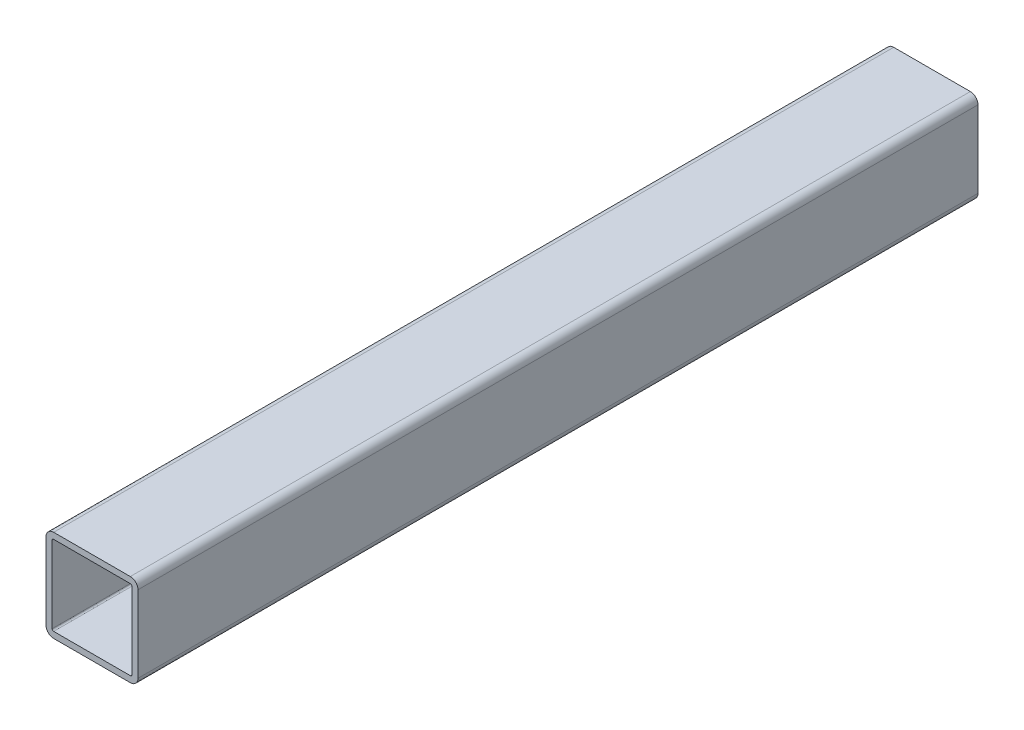
ISO-10303-21;
HEADER;
FILE_DESCRIPTION(('STEP AP214'),'2;1');
FILE_NAME('part.step','',(''),(''),'','','');
FILE_SCHEMA(('AUTOMOTIVE_DESIGN { 1 0 10303 214 1 1 1 1 }'));
ENDSEC;
DATA;
#1=APPLICATION_CONTEXT('core data for automotive mechanical design processes');
#2=APPLICATION_PROTOCOL_DEFINITION('international standard','automotive_design',2000,#1);
#3=PRODUCT_CONTEXT('',#1,'mechanical');
#4=PRODUCT('Part','Part','',(#3));
#5=PRODUCT_RELATED_PRODUCT_CATEGORY('part','',(#4));
#6=PRODUCT_DEFINITION_FORMATION('','',#4);
#7=PRODUCT_DEFINITION_CONTEXT('part definition',#1,'design');
#8=PRODUCT_DEFINITION('design','',#6,#7);
#9=PRODUCT_DEFINITION_SHAPE('','',#8);
#10=(LENGTH_UNIT() NAMED_UNIT(*) SI_UNIT(.MILLI.,.METRE.));
#11=(NAMED_UNIT(*) PLANE_ANGLE_UNIT() SI_UNIT($,.RADIAN.));
#12=(NAMED_UNIT(*) SI_UNIT($,.STERADIAN.) SOLID_ANGLE_UNIT());
#13=UNCERTAINTY_MEASURE_WITH_UNIT(LENGTH_MEASURE(1.E-05),#10,'distance_accuracy_value','');
#14=(GEOMETRIC_REPRESENTATION_CONTEXT(3) GLOBAL_UNCERTAINTY_ASSIGNED_CONTEXT((#13)) GLOBAL_UNIT_ASSIGNED_CONTEXT((#10,
#11,#12)) REPRESENTATION_CONTEXT('',''));
#15=CARTESIAN_POINT('',(0.,0.,0.));
#16=DIRECTION('',(0.,0.,1.));
#17=DIRECTION('',(1.,0.,0.));
#18=AXIS2_PLACEMENT_3D('',#15,#16,#17);
#19=CARTESIAN_POINT('',(-12.5,12.5,137.));
#20=DIRECTION('',(0.,0.,-1.));
#21=DIRECTION('',(-1.,0.,0.));
#22=AXIS2_PLACEMENT_3D('',#19,#20,#21);
#23=CYLINDRICAL_SURFACE('',#22,0.499999999999995);
#24=DIRECTION('',(0.,0.,1.));
#25=VECTOR('',#24,1.);
#26=CARTESIAN_POINT('',(-12.5,13.,137.));
#27=LINE('',#26,#25);
#28=CARTESIAN_POINT('',(-12.5,13.,137.));
#29=VERTEX_POINT('',#28);
#30=CARTESIAN_POINT('',(-12.5,13.,-137.));
#31=VERTEX_POINT('',#30);
#32=EDGE_CURVE('E135',#29,#31,#27,.F.);
#33=ORIENTED_EDGE('',*,*,#32,.F.);
#34=CARTESIAN_POINT('',(-12.5,12.5,137.));
#35=DIRECTION('',(0.,0.,-1.));
#36=DIRECTION('',(-1.,0.,0.));
#37=AXIS2_PLACEMENT_3D('',#34,#35,#36);
#38=CIRCLE('',#37,0.499999999999995);
#39=CARTESIAN_POINT('',(-13.,12.5,137.));
#40=VERTEX_POINT('',#39);
#41=EDGE_CURVE('E19',#40,#29,#38,.T.);
#42=ORIENTED_EDGE('',*,*,#41,.F.);
#43=DIRECTION('',(0.,0.,-1.));
#44=VECTOR('',#43,1.);
#45=CARTESIAN_POINT('',(-13.,12.5,137.));
#46=LINE('',#45,#44);
#47=CARTESIAN_POINT('',(-13.,12.5,-137.));
#48=VERTEX_POINT('',#47);
#49=EDGE_CURVE('E139',#48,#40,#46,.F.);
#50=ORIENTED_EDGE('',*,*,#49,.F.);
#51=CARTESIAN_POINT('',(-12.5,12.5,-137.));
#52=DIRECTION('',(0.,0.,-1.));
#53=DIRECTION('',(-1.,0.,0.));
#54=AXIS2_PLACEMENT_3D('',#51,#52,#53);
#55=CIRCLE('',#54,0.499999999999995);
#56=EDGE_CURVE('E133',#31,#48,#55,.F.);
#57=ORIENTED_EDGE('',*,*,#56,.F.);
#58=EDGE_LOOP('',(#33,#42,#50,#57));
#59=FACE_BOUND('',#58,.T.);
#60=ADVANCED_FACE('F16',(#59),#23,.F.);
#61=CARTESIAN_POINT('',(12.5,12.5,137.));
#62=DIRECTION('',(0.,0.,-1.));
#63=DIRECTION('',(-1.,0.,0.));
#64=AXIS2_PLACEMENT_3D('',#61,#62,#63);
#65=CYLINDRICAL_SURFACE('',#64,0.499999999999999);
#66=DIRECTION('',(0.,0.,1.));
#67=VECTOR('',#66,1.);
#68=CARTESIAN_POINT('',(13.,12.5,137.));
#69=LINE('',#68,#67);
#70=CARTESIAN_POINT('',(13.,12.5,137.));
#71=VERTEX_POINT('',#70);
#72=CARTESIAN_POINT('',(13.,12.5,-137.));
#73=VERTEX_POINT('',#72);
#74=EDGE_CURVE('E204',#71,#73,#69,.F.);
#75=ORIENTED_EDGE('',*,*,#74,.F.);
#76=CARTESIAN_POINT('',(12.5,12.5,137.));
#77=DIRECTION('',(0.,0.,-1.));
#78=DIRECTION('',(-1.,0.,0.));
#79=AXIS2_PLACEMENT_3D('',#76,#77,#78);
#80=CIRCLE('',#79,0.499999999999999);
#81=CARTESIAN_POINT('',(12.5,13.,137.));
#82=VERTEX_POINT('',#81);
#83=EDGE_CURVE('E248',#82,#71,#80,.T.);
#84=ORIENTED_EDGE('',*,*,#83,.F.);
#85=DIRECTION('',(0.,0.,1.));
#86=VECTOR('',#85,1.);
#87=CARTESIAN_POINT('',(12.5,13.,137.));
#88=LINE('',#87,#86);
#89=CARTESIAN_POINT('',(12.5,13.,-137.));
#90=VERTEX_POINT('',#89);
#91=EDGE_CURVE('E140',#90,#82,#88,.T.);
#92=ORIENTED_EDGE('',*,*,#91,.F.);
#93=CARTESIAN_POINT('',(12.5,12.5,-137.));
#94=DIRECTION('',(0.,0.,-1.));
#95=DIRECTION('',(-1.,0.,0.));
#96=AXIS2_PLACEMENT_3D('',#93,#94,#95);
#97=CIRCLE('',#96,0.499999999999999);
#98=EDGE_CURVE('E228',#73,#90,#97,.F.);
#99=ORIENTED_EDGE('',*,*,#98,.F.);
#100=EDGE_LOOP('',(#75,#84,#92,#99));
#101=FACE_BOUND('',#100,.T.);
#102=ADVANCED_FACE('F273',(#101),#65,.F.);
#103=CARTESIAN_POINT('',(-15.,-12.5,137.));
#104=DIRECTION('',(1.,0.,0.));
#105=DIRECTION('',(0.,0.,-1.));
#106=AXIS2_PLACEMENT_3D('',#103,#104,#105);
#107=PLANE('',#106);
#108=DIRECTION('',(0.,0.,-1.));
#109=VECTOR('',#108,1.);
#110=CARTESIAN_POINT('',(-15.,-12.5,137.));
#111=LINE('',#110,#109);
#112=CARTESIAN_POINT('',(-15.,-12.5,137.));
#113=VERTEX_POINT('',#112);
#114=CARTESIAN_POINT('',(-15.,-12.5,-137.));
#115=VERTEX_POINT('',#114);
#116=EDGE_CURVE('E205',#113,#115,#111,.T.);
#117=ORIENTED_EDGE('',*,*,#116,.F.);
#118=DIRECTION('',(0.,1.,0.));
#119=VECTOR('',#118,1.);
#120=CARTESIAN_POINT('',(-15.,-12.5,137.));
#121=LINE('',#120,#119);
#122=CARTESIAN_POINT('',(-15.,12.5,137.));
#123=VERTEX_POINT('',#122);
#124=EDGE_CURVE('E162',#113,#123,#121,.T.);
#125=ORIENTED_EDGE('',*,*,#124,.T.);
#126=DIRECTION('',(0.,0.,-1.));
#127=VECTOR('',#126,1.);
#128=CARTESIAN_POINT('',(-15.,12.5,137.));
#129=LINE('',#128,#127);
#130=CARTESIAN_POINT('',(-15.,12.5,-137.));
#131=VERTEX_POINT('',#130);
#132=EDGE_CURVE('E225',#131,#123,#129,.F.);
#133=ORIENTED_EDGE('',*,*,#132,.F.);
#134=DIRECTION('',(0.,1.,0.));
#135=VECTOR('',#134,1.);
#136=CARTESIAN_POINT('',(-15.,-12.5,-137.));
#137=LINE('',#136,#135);
#138=EDGE_CURVE('E195',#115,#131,#137,.T.);
#139=ORIENTED_EDGE('',*,*,#138,.F.);
#140=EDGE_LOOP('',(#117,#125,#133,#139));
#141=FACE_BOUND('',#140,.T.);
#142=ADVANCED_FACE('F275',(#141),#107,.F.);
#143=CARTESIAN_POINT('',(-12.5,12.5,137.));
#144=DIRECTION('',(0.,0.,-1.));
#145=DIRECTION('',(-1.,0.,0.));
#146=AXIS2_PLACEMENT_3D('',#143,#144,#145);
#147=CYLINDRICAL_SURFACE('',#146,2.5);
#148=CARTESIAN_POINT('',(-12.5,12.5,137.));
#149=DIRECTION('',(0.,0.,-1.));
#150=DIRECTION('',(-1.,0.,0.));
#151=AXIS2_PLACEMENT_3D('',#148,#149,#150);
#152=CIRCLE('',#151,2.5);
#153=CARTESIAN_POINT('',(-12.5,15.,137.));
#154=VERTEX_POINT('',#153);
#155=EDGE_CURVE('E161',#123,#154,#152,.T.);
#156=ORIENTED_EDGE('',*,*,#155,.T.);
#157=DIRECTION('',(0.,0.,1.));
#158=VECTOR('',#157,1.);
#159=CARTESIAN_POINT('',(-12.5,15.,137.));
#160=LINE('',#159,#158);
#161=CARTESIAN_POINT('',(-12.5,15.,-137.));
#162=VERTEX_POINT('',#161);
#163=EDGE_CURVE('E223',#154,#162,#160,.F.);
#164=ORIENTED_EDGE('',*,*,#163,.T.);
#165=CARTESIAN_POINT('',(-12.5,12.5,-137.));
#166=DIRECTION('',(0.,0.,-1.));
#167=DIRECTION('',(-1.,0.,0.));
#168=AXIS2_PLACEMENT_3D('',#165,#166,#167);
#169=CIRCLE('',#168,2.5);
#170=EDGE_CURVE('E194',#131,#162,#169,.T.);
#171=ORIENTED_EDGE('',*,*,#170,.F.);
#172=ORIENTED_EDGE('',*,*,#132,.T.);
#173=EDGE_LOOP('',(#156,#164,#171,#172));
#174=FACE_BOUND('',#173,.T.);
#175=ADVANCED_FACE('F281',(#174),#147,.T.);
#176=CARTESIAN_POINT('',(-12.5,15.,137.));
#177=DIRECTION('',(0.,-1.,0.));
#178=DIRECTION('',(1.,0.,0.));
#179=AXIS2_PLACEMENT_3D('',#176,#177,#178);
#180=PLANE('',#179);
#181=ORIENTED_EDGE('',*,*,#163,.F.);
#182=DIRECTION('',(-1.,0.,0.));
#183=VECTOR('',#182,1.);
#184=CARTESIAN_POINT('',(-12.5,15.,137.));
#185=LINE('',#184,#183);
#186=CARTESIAN_POINT('',(12.5,15.,137.));
#187=VERTEX_POINT('',#186);
#188=EDGE_CURVE('E159',#154,#187,#185,.F.);
#189=ORIENTED_EDGE('',*,*,#188,.T.);
#190=DIRECTION('',(0.,0.,-1.));
#191=VECTOR('',#190,1.);
#192=CARTESIAN_POINT('',(12.5,15.,137.));
#193=LINE('',#192,#191);
#194=CARTESIAN_POINT('',(12.5,15.,-137.));
#195=VERTEX_POINT('',#194);
#196=EDGE_CURVE('E220',#195,#187,#193,.F.);
#197=ORIENTED_EDGE('',*,*,#196,.F.);
#198=DIRECTION('',(-1.,0.,0.));
#199=VECTOR('',#198,1.);
#200=CARTESIAN_POINT('',(-12.5,15.,-137.));
#201=LINE('',#200,#199);
#202=EDGE_CURVE('E191',#162,#195,#201,.F.);
#203=ORIENTED_EDGE('',*,*,#202,.F.);
#204=EDGE_LOOP('',(#181,#189,#197,#203));
#205=FACE_BOUND('',#204,.T.);
#206=ADVANCED_FACE('F323',(#205),#180,.F.);
#207=CARTESIAN_POINT('',(12.5,12.5,137.));
#208=DIRECTION('',(0.,0.,-1.));
#209=DIRECTION('',(-1.,0.,0.));
#210=AXIS2_PLACEMENT_3D('',#207,#208,#209);
#211=CYLINDRICAL_SURFACE('',#210,2.5);
#212=CARTESIAN_POINT('',(12.5,12.5,137.));
#213=DIRECTION('',(0.,0.,-1.));
#214=DIRECTION('',(-1.,0.,0.));
#215=AXIS2_PLACEMENT_3D('',#212,#213,#214);
#216=CIRCLE('',#215,2.5);
#217=CARTESIAN_POINT('',(15.,12.5,137.));
#218=VERTEX_POINT('',#217);
#219=EDGE_CURVE('E158',#187,#218,#216,.T.);
#220=ORIENTED_EDGE('',*,*,#219,.T.);
#221=DIRECTION('',(0.,0.,1.));
#222=VECTOR('',#221,1.);
#223=CARTESIAN_POINT('',(15.,12.5,137.));
#224=LINE('',#223,#222);
#225=CARTESIAN_POINT('',(15.,12.5,-137.));
#226=VERTEX_POINT('',#225);
#227=EDGE_CURVE('E218',#218,#226,#224,.F.);
#228=ORIENTED_EDGE('',*,*,#227,.T.);
#229=CARTESIAN_POINT('',(12.5,12.5,-137.));
#230=DIRECTION('',(0.,0.,-1.));
#231=DIRECTION('',(-1.,0.,0.));
#232=AXIS2_PLACEMENT_3D('',#229,#230,#231);
#233=CIRCLE('',#232,2.5);
#234=EDGE_CURVE('E190',#195,#226,#233,.T.);
#235=ORIENTED_EDGE('',*,*,#234,.F.);
#236=ORIENTED_EDGE('',*,*,#196,.T.);
#237=EDGE_LOOP('',(#220,#228,#235,#236));
#238=FACE_BOUND('',#237,.T.);
#239=ADVANCED_FACE('F319',(#238),#211,.T.);
#240=CARTESIAN_POINT('',(15.,-12.5,137.));
#241=DIRECTION('',(-1.,0.,0.));
#242=DIRECTION('',(0.,-1.,0.));
#243=AXIS2_PLACEMENT_3D('',#240,#241,#242);
#244=PLANE('',#243);
#245=ORIENTED_EDGE('',*,*,#227,.F.);
#246=DIRECTION('',(0.,1.,0.));
#247=VECTOR('',#246,1.);
#248=CARTESIAN_POINT('',(15.,-12.5,137.));
#249=LINE('',#248,#247);
#250=CARTESIAN_POINT('',(15.,-12.5,137.));
#251=VERTEX_POINT('',#250);
#252=EDGE_CURVE('E156',#218,#251,#249,.F.);
#253=ORIENTED_EDGE('',*,*,#252,.T.);
#254=DIRECTION('',(0.,0.,-1.));
#255=VECTOR('',#254,1.);
#256=CARTESIAN_POINT('',(15.,-12.5,137.));
#257=LINE('',#256,#255);
#258=CARTESIAN_POINT('',(15.,-12.5,-137.));
#259=VERTEX_POINT('',#258);
#260=EDGE_CURVE('E215',#259,#251,#257,.F.);
#261=ORIENTED_EDGE('',*,*,#260,.F.);
#262=DIRECTION('',(0.,1.,0.));
#263=VECTOR('',#262,1.);
#264=CARTESIAN_POINT('',(15.,-12.5,-137.));
#265=LINE('',#264,#263);
#266=EDGE_CURVE('E187',#226,#259,#265,.F.);
#267=ORIENTED_EDGE('',*,*,#266,.F.);
#268=EDGE_LOOP('',(#245,#253,#261,#267));
#269=FACE_BOUND('',#268,.T.);
#270=ADVANCED_FACE('F315',(#269),#244,.F.);
#271=CARTESIAN_POINT('',(12.5,-12.5,137.));
#272=DIRECTION('',(0.,0.,-1.));
#273=DIRECTION('',(-1.,0.,0.));
#274=AXIS2_PLACEMENT_3D('',#271,#272,#273);
#275=CYLINDRICAL_SURFACE('',#274,2.50000000000001);
#276=CARTESIAN_POINT('',(12.5,-12.5,137.));
#277=DIRECTION('',(0.,0.,-1.));
#278=DIRECTION('',(-1.,0.,0.));
#279=AXIS2_PLACEMENT_3D('',#276,#277,#278);
#280=CIRCLE('',#279,2.50000000000001);
#281=CARTESIAN_POINT('',(12.5,-15.,137.));
#282=VERTEX_POINT('',#281);
#283=EDGE_CURVE('E155',#251,#282,#280,.T.);
#284=ORIENTED_EDGE('',*,*,#283,.T.);
#285=DIRECTION('',(0.,0.,1.));
#286=VECTOR('',#285,1.);
#287=CARTESIAN_POINT('',(12.5,-15.,137.));
#288=LINE('',#287,#286);
#289=CARTESIAN_POINT('',(12.5,-15.,-137.));
#290=VERTEX_POINT('',#289);
#291=EDGE_CURVE('E212',#282,#290,#288,.F.);
#292=ORIENTED_EDGE('',*,*,#291,.T.);
#293=CARTESIAN_POINT('',(12.5,-12.5,-137.));
#294=DIRECTION('',(0.,0.,-1.));
#295=DIRECTION('',(-1.,0.,0.));
#296=AXIS2_PLACEMENT_3D('',#293,#294,#295);
#297=CIRCLE('',#296,2.50000000000001);
#298=EDGE_CURVE('E186',#259,#290,#297,.T.);
#299=ORIENTED_EDGE('',*,*,#298,.F.);
#300=ORIENTED_EDGE('',*,*,#260,.T.);
#301=EDGE_LOOP('',(#284,#292,#299,#300));
#302=FACE_BOUND('',#301,.T.);
#303=ADVANCED_FACE('F311',(#302),#275,.T.);
#304=CARTESIAN_POINT('',(-12.5,-15.,137.));
#305=DIRECTION('',(0.,1.,0.));
#306=DIRECTION('',(-1.,0.,0.));
#307=AXIS2_PLACEMENT_3D('',#304,#305,#306);
#308=PLANE('',#307);
#309=ORIENTED_EDGE('',*,*,#291,.F.);
#310=DIRECTION('',(-1.,0.,0.));
#311=VECTOR('',#310,1.);
#312=CARTESIAN_POINT('',(-12.5,-15.,137.));
#313=LINE('',#312,#311);
#314=CARTESIAN_POINT('',(-12.5,-15.,137.));
#315=VERTEX_POINT('',#314);
#316=EDGE_CURVE('E153',#282,#315,#313,.T.);
#317=ORIENTED_EDGE('',*,*,#316,.T.);
#318=DIRECTION('',(0.,0.,-1.));
#319=VECTOR('',#318,1.);
#320=CARTESIAN_POINT('',(-12.5,-15.,137.));
#321=LINE('',#320,#319);
#322=CARTESIAN_POINT('',(-12.5,-15.,-137.));
#323=VERTEX_POINT('',#322);
#324=EDGE_CURVE('E209',#323,#315,#321,.F.);
#325=ORIENTED_EDGE('',*,*,#324,.F.);
#326=DIRECTION('',(-1.,0.,0.));
#327=VECTOR('',#326,1.);
#328=CARTESIAN_POINT('',(-12.5,-15.,-137.));
#329=LINE('',#328,#327);
#330=EDGE_CURVE('E183',#290,#323,#329,.T.);
#331=ORIENTED_EDGE('',*,*,#330,.F.);
#332=EDGE_LOOP('',(#309,#317,#325,#331));
#333=FACE_BOUND('',#332,.T.);
#334=ADVANCED_FACE('F307',(#333),#308,.F.);
#335=CARTESIAN_POINT('',(-12.5,-12.5,137.));
#336=DIRECTION('',(0.,0.,-1.));
#337=DIRECTION('',(-1.,0.,0.));
#338=AXIS2_PLACEMENT_3D('',#335,#336,#337);
#339=CYLINDRICAL_SURFACE('',#338,2.5);
#340=CARTESIAN_POINT('',(-12.5,-12.5,137.));
#341=DIRECTION('',(0.,0.,-1.));
#342=DIRECTION('',(-1.,0.,0.));
#343=AXIS2_PLACEMENT_3D('',#340,#341,#342);
#344=CIRCLE('',#343,2.5);
#345=EDGE_CURVE('E150',#315,#113,#344,.T.);
#346=ORIENTED_EDGE('',*,*,#345,.T.);
#347=ORIENTED_EDGE('',*,*,#116,.T.);
#348=CARTESIAN_POINT('',(-12.5,-12.5,-137.));
#349=DIRECTION('',(0.,0.,-1.));
#350=DIRECTION('',(-1.,0.,0.));
#351=AXIS2_PLACEMENT_3D('',#348,#349,#350);
#352=CIRCLE('',#351,2.5);
#353=EDGE_CURVE('E198',#323,#115,#352,.T.);
#354=ORIENTED_EDGE('',*,*,#353,.F.);
#355=ORIENTED_EDGE('',*,*,#324,.T.);
#356=EDGE_LOOP('',(#346,#347,#354,#355));
#357=FACE_BOUND('',#356,.T.);
#358=ADVANCED_FACE('F304',(#357),#339,.T.);
#359=CARTESIAN_POINT('',(-12.5,13.,137.));
#360=DIRECTION('',(0.,-1.,0.));
#361=DIRECTION('',(1.,0.,0.));
#362=AXIS2_PLACEMENT_3D('',#359,#360,#361);
#363=PLANE('',#362);
#364=DIRECTION('',(-1.,0.,0.));
#365=VECTOR('',#364,1.);
#366=CARTESIAN_POINT('',(-12.5,13.,137.));
#367=LINE('',#366,#365);
#368=EDGE_CURVE('E130',#82,#29,#367,.T.);
#369=ORIENTED_EDGE('',*,*,#368,.T.);
#370=ORIENTED_EDGE('',*,*,#32,.T.);
#371=DIRECTION('',(-1.,0.,0.));
#372=VECTOR('',#371,1.);
#373=CARTESIAN_POINT('',(-12.5,13.,-137.));
#374=LINE('',#373,#372);
#375=EDGE_CURVE('E174',#90,#31,#374,.T.);
#376=ORIENTED_EDGE('',*,*,#375,.F.);
#377=ORIENTED_EDGE('',*,*,#91,.T.);
#378=EDGE_LOOP('',(#369,#370,#376,#377));
#379=FACE_BOUND('',#378,.T.);
#380=ADVANCED_FACE('F143',(#379),#363,.T.);
#381=CARTESIAN_POINT('',(-13.,-12.5,137.));
#382=DIRECTION('',(1.,0.,0.));
#383=DIRECTION('',(0.,0.,-1.));
#384=AXIS2_PLACEMENT_3D('',#381,#382,#383);
#385=PLANE('',#384);
#386=DIRECTION('',(0.,1.,0.));
#387=VECTOR('',#386,1.);
#388=CARTESIAN_POINT('',(-13.,-12.5,137.));
#389=LINE('',#388,#387);
#390=CARTESIAN_POINT('',(-13.,-12.5,137.));
#391=VERTEX_POINT('',#390);
#392=EDGE_CURVE('E132',#40,#391,#389,.F.);
#393=ORIENTED_EDGE('',*,*,#392,.T.);
#394=DIRECTION('',(0.,0.,-1.));
#395=VECTOR('',#394,1.);
#396=CARTESIAN_POINT('',(-13.,-12.5,137.));
#397=LINE('',#396,#395);
#398=CARTESIAN_POINT('',(-13.,-12.5,-137.));
#399=VERTEX_POINT('',#398);
#400=EDGE_CURVE('E176',#391,#399,#397,.T.);
#401=ORIENTED_EDGE('',*,*,#400,.T.);
#402=DIRECTION('',(0.,1.,0.));
#403=VECTOR('',#402,1.);
#404=CARTESIAN_POINT('',(-13.,-12.5,-137.));
#405=LINE('',#404,#403);
#406=EDGE_CURVE('E180',#48,#399,#405,.F.);
#407=ORIENTED_EDGE('',*,*,#406,.F.);
#408=ORIENTED_EDGE('',*,*,#49,.T.);
#409=EDGE_LOOP('',(#393,#401,#407,#408));
#410=FACE_BOUND('',#409,.T.);
#411=ADVANCED_FACE('F255',(#410),#385,.T.);
#412=CARTESIAN_POINT('',(13.,-12.5,137.));
#413=DIRECTION('',(-1.,0.,0.));
#414=DIRECTION('',(0.,0.,1.));
#415=AXIS2_PLACEMENT_3D('',#412,#413,#414);
#416=PLANE('',#415);
#417=DIRECTION('',(0.,1.,0.));
#418=VECTOR('',#417,1.);
#419=CARTESIAN_POINT('',(13.,-12.5,137.));
#420=LINE('',#419,#418);
#421=CARTESIAN_POINT('',(13.,-12.5,137.));
#422=VERTEX_POINT('',#421);
#423=EDGE_CURVE('E145',#422,#71,#420,.T.);
#424=ORIENTED_EDGE('',*,*,#423,.T.);
#425=ORIENTED_EDGE('',*,*,#74,.T.);
#426=DIRECTION('',(0.,1.,0.));
#427=VECTOR('',#426,1.);
#428=CARTESIAN_POINT('',(13.,-12.5,-137.));
#429=LINE('',#428,#427);
#430=CARTESIAN_POINT('',(13.,-12.5,-137.));
#431=VERTEX_POINT('',#430);
#432=EDGE_CURVE('E177',#431,#73,#429,.T.);
#433=ORIENTED_EDGE('',*,*,#432,.F.);
#434=DIRECTION('',(0.,0.,-1.));
#435=VECTOR('',#434,1.);
#436=CARTESIAN_POINT('',(13.,-12.5,137.));
#437=LINE('',#436,#435);
#438=EDGE_CURVE('E199',#431,#422,#437,.F.);
#439=ORIENTED_EDGE('',*,*,#438,.T.);
#440=EDGE_LOOP('',(#424,#425,#433,#439));
#441=FACE_BOUND('',#440,.T.);
#442=ADVANCED_FACE('F270',(#441),#416,.T.);
#443=CARTESIAN_POINT('',(-12.5,-12.5,-137.));
#444=DIRECTION('',(0.,0.,-1.));
#445=DIRECTION('',(-1.,0.,0.));
#446=AXIS2_PLACEMENT_3D('',#443,#444,#445);
#447=PLANE('',#446);
#448=ORIENTED_EDGE('',*,*,#375,.T.);
#449=ORIENTED_EDGE('',*,*,#56,.T.);
#450=ORIENTED_EDGE('',*,*,#406,.T.);
#451=CARTESIAN_POINT('',(-12.5,-12.5,-137.));
#452=DIRECTION('',(0.,0.,-1.));
#453=DIRECTION('',(-1.,0.,0.));
#454=AXIS2_PLACEMENT_3D('',#451,#452,#453);
#455=CIRCLE('',#454,0.499999999999995);
#456=CARTESIAN_POINT('',(-12.5,-13.,-137.));
#457=VERTEX_POINT('',#456);
#458=EDGE_CURVE('E164',#399,#457,#455,.F.);
#459=ORIENTED_EDGE('',*,*,#458,.T.);
#460=DIRECTION('',(-1.,0.,0.));
#461=VECTOR('',#460,1.);
#462=CARTESIAN_POINT('',(-12.5,-13.,-137.));
#463=LINE('',#462,#461);
#464=CARTESIAN_POINT('',(12.5,-13.,-137.));
#465=VERTEX_POINT('',#464);
#466=EDGE_CURVE('E168',#465,#457,#463,.T.);
#467=ORIENTED_EDGE('',*,*,#466,.F.);
#468=CARTESIAN_POINT('',(12.5,-12.5,-137.));
#469=DIRECTION('',(0.,0.,-1.));
#470=DIRECTION('',(-1.,0.,0.));
#471=AXIS2_PLACEMENT_3D('',#468,#469,#470);
#472=CIRCLE('',#471,0.499999999999999);
#473=EDGE_CURVE('E173',#465,#431,#472,.F.);
#474=ORIENTED_EDGE('',*,*,#473,.T.);
#475=ORIENTED_EDGE('',*,*,#432,.T.);
#476=ORIENTED_EDGE('',*,*,#98,.T.);
#477=EDGE_LOOP('',(#448,#449,#450,#459,#467,#474,#475,#476));
#478=FACE_BOUND('',#477,.T.);
#479=ORIENTED_EDGE('',*,*,#298,.T.);
#480=ORIENTED_EDGE('',*,*,#330,.T.);
#481=ORIENTED_EDGE('',*,*,#353,.T.);
#482=ORIENTED_EDGE('',*,*,#138,.T.);
#483=ORIENTED_EDGE('',*,*,#170,.T.);
#484=ORIENTED_EDGE('',*,*,#202,.T.);
#485=ORIENTED_EDGE('',*,*,#234,.T.);
#486=ORIENTED_EDGE('',*,*,#266,.T.);
#487=EDGE_LOOP('',(#479,#480,#481,#482,#483,#484,#485,#486));
#488=FACE_BOUND('',#487,.T.);
#489=ADVANCED_FACE('F250',(#478,#488),#447,.T.);
#490=CARTESIAN_POINT('',(-12.5,-12.5,137.));
#491=DIRECTION('',(0.,0.,-1.));
#492=DIRECTION('',(-1.,0.,0.));
#493=AXIS2_PLACEMENT_3D('',#490,#491,#492);
#494=CYLINDRICAL_SURFACE('',#493,0.499999999999995);
#495=ORIENTED_EDGE('',*,*,#400,.F.);
#496=CARTESIAN_POINT('',(-12.5,-12.5,137.));
#497=DIRECTION('',(0.,0.,-1.));
#498=DIRECTION('',(-1.,0.,0.));
#499=AXIS2_PLACEMENT_3D('',#496,#497,#498);
#500=CIRCLE('',#499,0.499999999999995);
#501=CARTESIAN_POINT('',(-12.5,-13.,137.));
#502=VERTEX_POINT('',#501);
#503=EDGE_CURVE('E147',#391,#502,#500,.F.);
#504=ORIENTED_EDGE('',*,*,#503,.T.);
#505=DIRECTION('',(0.,0.,1.));
#506=VECTOR('',#505,1.);
#507=CARTESIAN_POINT('',(-12.5,-13.,137.));
#508=LINE('',#507,#506);
#509=EDGE_CURVE('E165',#457,#502,#508,.T.);
#510=ORIENTED_EDGE('',*,*,#509,.F.);
#511=ORIENTED_EDGE('',*,*,#458,.F.);
#512=EDGE_LOOP('',(#495,#504,#510,#511));
#513=FACE_BOUND('',#512,.T.);
#514=ADVANCED_FACE('F258',(#513),#494,.F.);
#515=CARTESIAN_POINT('',(-12.5,-12.5,137.));
#516=DIRECTION('',(0.,0.,-1.));
#517=DIRECTION('',(-1.,0.,0.));
#518=AXIS2_PLACEMENT_3D('',#515,#516,#517);
#519=PLANE('',#518);
#520=ORIENTED_EDGE('',*,*,#392,.F.);
#521=ORIENTED_EDGE('',*,*,#41,.T.);
#522=ORIENTED_EDGE('',*,*,#368,.F.);
#523=ORIENTED_EDGE('',*,*,#83,.T.);
#524=ORIENTED_EDGE('',*,*,#423,.F.);
#525=CARTESIAN_POINT('',(12.5,-12.5,137.));
#526=DIRECTION('',(0.,0.,-1.));
#527=DIRECTION('',(-1.,0.,0.));
#528=AXIS2_PLACEMENT_3D('',#525,#526,#527);
#529=CIRCLE('',#528,0.499999999999999);
#530=CARTESIAN_POINT('',(12.5,-13.,137.));
#531=VERTEX_POINT('',#530);
#532=EDGE_CURVE('E34',#422,#531,#529,.T.);
#533=ORIENTED_EDGE('',*,*,#532,.T.);
#534=DIRECTION('',(-1.,0.,0.));
#535=VECTOR('',#534,1.);
#536=CARTESIAN_POINT('',(-12.5,-13.,137.));
#537=LINE('',#536,#535);
#538=EDGE_CURVE('E25',#502,#531,#537,.F.);
#539=ORIENTED_EDGE('',*,*,#538,.F.);
#540=ORIENTED_EDGE('',*,*,#503,.F.);
#541=EDGE_LOOP('',(#520,#521,#522,#523,#524,#533,#539,#540));
#542=FACE_BOUND('',#541,.T.);
#543=ORIENTED_EDGE('',*,*,#316,.F.);
#544=ORIENTED_EDGE('',*,*,#283,.F.);
#545=ORIENTED_EDGE('',*,*,#252,.F.);
#546=ORIENTED_EDGE('',*,*,#219,.F.);
#547=ORIENTED_EDGE('',*,*,#188,.F.);
#548=ORIENTED_EDGE('',*,*,#155,.F.);
#549=ORIENTED_EDGE('',*,*,#124,.F.);
#550=ORIENTED_EDGE('',*,*,#345,.F.);
#551=EDGE_LOOP('',(#543,#544,#545,#546,#547,#548,#549,#550));
#552=FACE_BOUND('',#551,.T.);
#553=ADVANCED_FACE('F127',(#542,#552),#519,.F.);
#554=CARTESIAN_POINT('',(12.5,-12.5,137.));
#555=DIRECTION('',(0.,0.,-1.));
#556=DIRECTION('',(-1.,0.,0.));
#557=AXIS2_PLACEMENT_3D('',#554,#555,#556);
#558=CYLINDRICAL_SURFACE('',#557,0.499999999999999);
#559=DIRECTION('',(0.,0.,1.));
#560=VECTOR('',#559,1.);
#561=CARTESIAN_POINT('',(12.5,-13.,137.));
#562=LINE('',#561,#560);
#563=EDGE_CURVE('E11',#531,#465,#562,.F.);
#564=ORIENTED_EDGE('',*,*,#563,.F.);
#565=ORIENTED_EDGE('',*,*,#532,.F.);
#566=ORIENTED_EDGE('',*,*,#438,.F.);
#567=ORIENTED_EDGE('',*,*,#473,.F.);
#568=EDGE_LOOP('',(#564,#565,#566,#567));
#569=FACE_BOUND('',#568,.T.);
#570=ADVANCED_FACE('F267',(#569),#558,.F.);
#571=CARTESIAN_POINT('',(-12.5,-13.,137.));
#572=DIRECTION('',(0.,1.,0.));
#573=DIRECTION('',(-1.,0.,0.));
#574=AXIS2_PLACEMENT_3D('',#571,#572,#573);
#575=PLANE('',#574);
#576=ORIENTED_EDGE('',*,*,#538,.T.);
#577=ORIENTED_EDGE('',*,*,#563,.T.);
#578=ORIENTED_EDGE('',*,*,#466,.T.);
#579=ORIENTED_EDGE('',*,*,#509,.T.);
#580=EDGE_LOOP('',(#576,#577,#578,#579));
#581=FACE_BOUND('',#580,.T.);
#582=ADVANCED_FACE('F261',(#581),#575,.T.);
#583=CLOSED_SHELL('',(#60,#102,#142,#175,#206,#239,#270,#303,#334,#358,#380,#411,#442,#489,#514,
#553,#570,#582));
#584=MANIFOLD_SOLID_BREP('B1',#583);
#585=ADVANCED_BREP_SHAPE_REPRESENTATION('',(#18,#584),#14);
#586=SHAPE_DEFINITION_REPRESENTATION(#9,#585);
ENDSEC;
END-ISO-10303-21;
